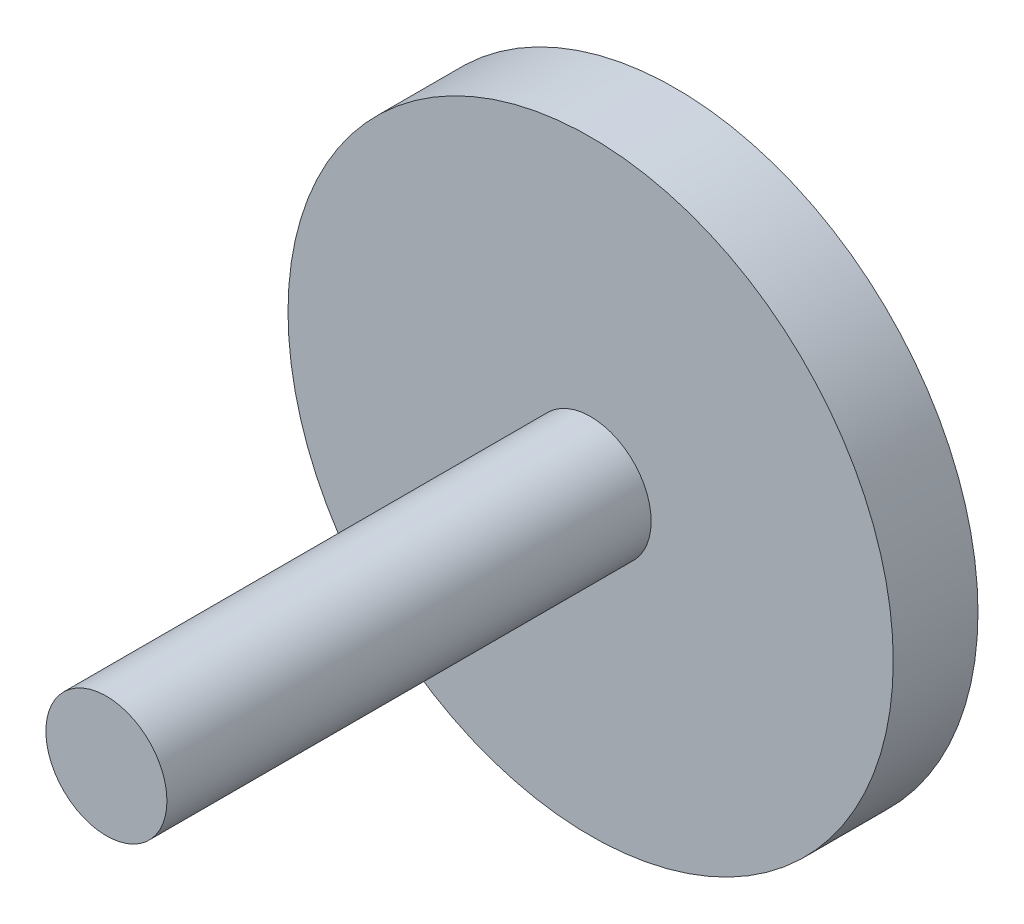
ISO-10303-21;
HEADER;
FILE_DESCRIPTION(('STEP AP214'),'2;1');
FILE_NAME('part.step','',(''),(''),'','','');
FILE_SCHEMA(('AUTOMOTIVE_DESIGN { 1 0 10303 214 1 1 1 1 }'));
ENDSEC;
DATA;
#1=APPLICATION_CONTEXT('core data for automotive mechanical design processes');
#2=APPLICATION_PROTOCOL_DEFINITION('international standard','automotive_design',2000,#1);
#3=PRODUCT_CONTEXT('',#1,'mechanical');
#4=PRODUCT('Part','Part','',(#3));
#5=PRODUCT_RELATED_PRODUCT_CATEGORY('part','',(#4));
#6=PRODUCT_DEFINITION_FORMATION('','',#4);
#7=PRODUCT_DEFINITION_CONTEXT('part definition',#1,'design');
#8=PRODUCT_DEFINITION('design','',#6,#7);
#9=PRODUCT_DEFINITION_SHAPE('','',#8);
#10=(LENGTH_UNIT() NAMED_UNIT(*) SI_UNIT(.MILLI.,.METRE.));
#11=(NAMED_UNIT(*) PLANE_ANGLE_UNIT() SI_UNIT($,.RADIAN.));
#12=(NAMED_UNIT(*) SI_UNIT($,.STERADIAN.) SOLID_ANGLE_UNIT());
#13=UNCERTAINTY_MEASURE_WITH_UNIT(LENGTH_MEASURE(1.E-05),#10,'distance_accuracy_value','');
#14=(GEOMETRIC_REPRESENTATION_CONTEXT(3) GLOBAL_UNCERTAINTY_ASSIGNED_CONTEXT((#13)) GLOBAL_UNIT_ASSIGNED_CONTEXT((#10,
#11,#12)) REPRESENTATION_CONTEXT('',''));
#15=CARTESIAN_POINT('',(0.,0.,0.));
#16=DIRECTION('',(0.,0.,1.));
#17=DIRECTION('',(1.,0.,0.));
#18=AXIS2_PLACEMENT_3D('',#15,#16,#17);
#19=CARTESIAN_POINT('',(0.,0.,7.));
#20=DIRECTION('',(0.,0.,-1.));
#21=DIRECTION('',(-1.,0.,0.));
#22=AXIS2_PLACEMENT_3D('',#19,#20,#21);
#23=CYLINDRICAL_SURFACE('',#22,25.);
#24=CARTESIAN_POINT('',(0.,0.,7.));
#25=DIRECTION('',(0.,0.,1.));
#26=DIRECTION('',(1.,0.,0.));
#27=AXIS2_PLACEMENT_3D('',#24,#25,#26);
#28=CIRCLE('',#27,25.);
#29=CARTESIAN_POINT('',(25.,0.,7.));
#30=VERTEX_POINT('',#29);
#31=EDGE_CURVE('E46',#30,#30,#28,.T.);
#32=ORIENTED_EDGE('',*,*,#31,.F.);
#33=EDGE_LOOP('',(#32));
#34=FACE_BOUND('',#33,.T.);
#35=CARTESIAN_POINT('',(0.,0.,0.));
#36=DIRECTION('',(0.,0.,1.));
#37=DIRECTION('',(1.,0.,0.));
#38=AXIS2_PLACEMENT_3D('',#35,#36,#37);
#39=CIRCLE('',#38,25.);
#40=CARTESIAN_POINT('',(25.,0.,0.));
#41=VERTEX_POINT('',#40);
#42=EDGE_CURVE('E42',#41,#41,#39,.T.);
#43=ORIENTED_EDGE('',*,*,#42,.T.);
#44=EDGE_LOOP('',(#43));
#45=FACE_BOUND('',#44,.T.);
#46=ADVANCED_FACE('F39',(#34,#45),#23,.T.);
#47=CARTESIAN_POINT('',(0.,0.,7.));
#48=DIRECTION('',(0.,0.,1.));
#49=DIRECTION('',(1.,0.,0.));
#50=AXIS2_PLACEMENT_3D('',#47,#48,#49);
#51=PLANE('',#50);
#52=CARTESIAN_POINT('',(0.,0.,7.));
#53=DIRECTION('',(0.,0.,1.));
#54=DIRECTION('',(1.,0.,0.));
#55=AXIS2_PLACEMENT_3D('',#52,#53,#54);
#56=CIRCLE('',#55,5.);
#57=CARTESIAN_POINT('',(5.,0.,7.));
#58=VERTEX_POINT('',#57);
#59=EDGE_CURVE('E10',#58,#58,#56,.T.);
#60=ORIENTED_EDGE('',*,*,#59,.F.);
#61=EDGE_LOOP('',(#60));
#62=FACE_BOUND('',#61,.T.);
#63=ORIENTED_EDGE('',*,*,#31,.T.);
#64=EDGE_LOOP('',(#63));
#65=FACE_BOUND('',#64,.T.);
#66=ADVANCED_FACE('F63',(#62,#65),#51,.T.);
#67=CARTESIAN_POINT('',(0.,0.,0.));
#68=DIRECTION('',(0.,0.,1.));
#69=DIRECTION('',(1.,0.,0.));
#70=AXIS2_PLACEMENT_3D('',#67,#68,#69);
#71=PLANE('',#70);
#72=ORIENTED_EDGE('',*,*,#42,.F.);
#73=EDGE_LOOP('',(#72));
#74=FACE_BOUND('',#73,.T.);
#75=ADVANCED_FACE('F60',(#74),#71,.F.);
#76=CARTESIAN_POINT('',(0.,0.,47.));
#77=DIRECTION('',(0.,0.,-1.));
#78=DIRECTION('',(-1.,0.,0.));
#79=AXIS2_PLACEMENT_3D('',#76,#77,#78);
#80=CYLINDRICAL_SURFACE('',#79,5.);
#81=CARTESIAN_POINT('',(0.,0.,47.));
#82=DIRECTION('',(0.,0.,1.));
#83=DIRECTION('',(1.,0.,0.));
#84=AXIS2_PLACEMENT_3D('',#81,#82,#83);
#85=CIRCLE('',#84,5.);
#86=CARTESIAN_POINT('',(5.,0.,47.));
#87=VERTEX_POINT('',#86);
#88=EDGE_CURVE('E52',#87,#87,#85,.T.);
#89=ORIENTED_EDGE('',*,*,#88,.F.);
#90=EDGE_LOOP('',(#89));
#91=FACE_BOUND('',#90,.T.);
#92=ORIENTED_EDGE('',*,*,#59,.T.);
#93=EDGE_LOOP('',(#92));
#94=FACE_BOUND('',#93,.T.);
#95=ADVANCED_FACE('F62',(#91,#94),#80,.T.);
#96=CARTESIAN_POINT('',(0.,0.,47.));
#97=DIRECTION('',(0.,0.,1.));
#98=DIRECTION('',(1.,0.,0.));
#99=AXIS2_PLACEMENT_3D('',#96,#97,#98);
#100=PLANE('',#99);
#101=ORIENTED_EDGE('',*,*,#88,.T.);
#102=EDGE_LOOP('',(#101));
#103=FACE_BOUND('',#102,.T.);
#104=ADVANCED_FACE('F69',(#103),#100,.T.);
#105=CLOSED_SHELL('',(#46,#66,#75,#95,#104));
#106=MANIFOLD_SOLID_BREP('B2',#105);
#107=ADVANCED_BREP_SHAPE_REPRESENTATION('',(#18,#106),#14);
#108=SHAPE_DEFINITION_REPRESENTATION(#9,#107);
ENDSEC;
END-ISO-10303-21;
